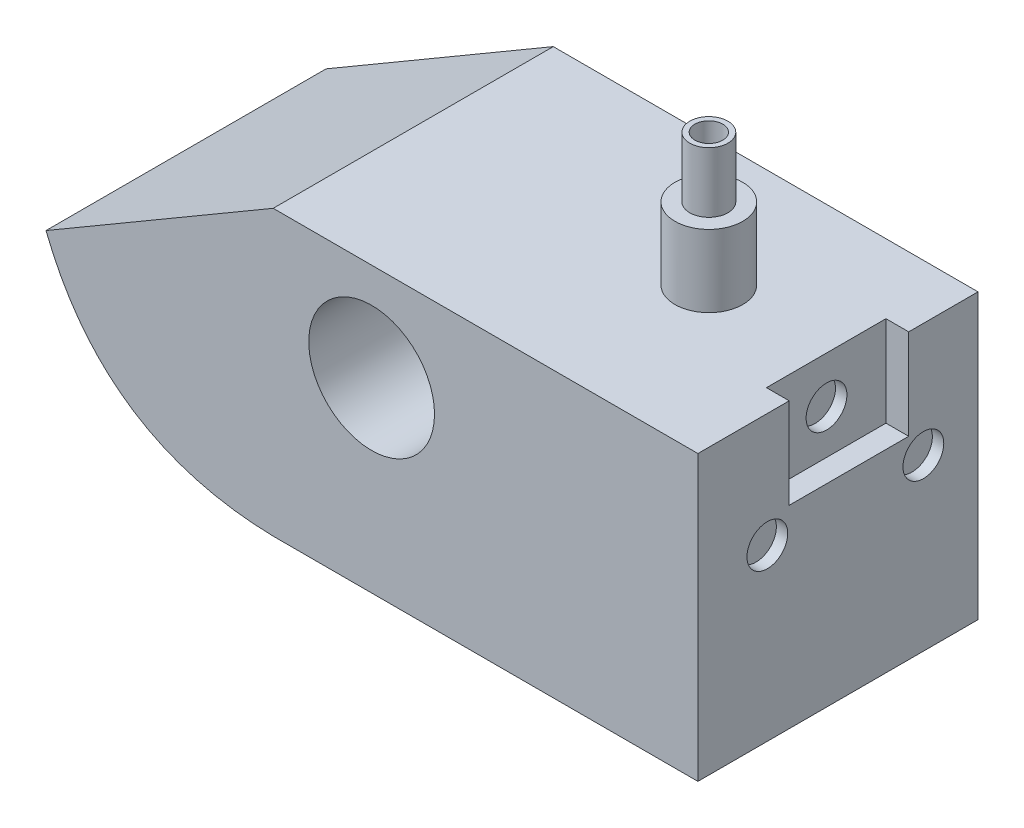
ISO-10303-21;
HEADER;
FILE_DESCRIPTION(('STEP AP214'),'2;1');
FILE_NAME('part.step','',(''),(''),'','','');
FILE_SCHEMA(('AUTOMOTIVE_DESIGN { 1 0 10303 214 1 1 1 1 }'));
ENDSEC;
DATA;
#1=APPLICATION_CONTEXT('core data for automotive mechanical design processes');
#2=APPLICATION_PROTOCOL_DEFINITION('international standard','automotive_design',2000,#1);
#3=PRODUCT_CONTEXT('',#1,'mechanical');
#4=PRODUCT('Part','Part','',(#3));
#5=PRODUCT_RELATED_PRODUCT_CATEGORY('part','',(#4));
#6=PRODUCT_DEFINITION_FORMATION('','',#4);
#7=PRODUCT_DEFINITION_CONTEXT('part definition',#1,'design');
#8=PRODUCT_DEFINITION('design','',#6,#7);
#9=PRODUCT_DEFINITION_SHAPE('','',#8);
#10=(LENGTH_UNIT() NAMED_UNIT(*) SI_UNIT(.MILLI.,.METRE.));
#11=(NAMED_UNIT(*) PLANE_ANGLE_UNIT() SI_UNIT($,.RADIAN.));
#12=(NAMED_UNIT(*) SI_UNIT($,.STERADIAN.) SOLID_ANGLE_UNIT());
#13=UNCERTAINTY_MEASURE_WITH_UNIT(LENGTH_MEASURE(1.E-05),#10,'distance_accuracy_value','');
#14=(GEOMETRIC_REPRESENTATION_CONTEXT(3) GLOBAL_UNCERTAINTY_ASSIGNED_CONTEXT((#13)) GLOBAL_UNIT_ASSIGNED_CONTEXT((#10,
#11,#12)) REPRESENTATION_CONTEXT('',''));
#15=CARTESIAN_POINT('',(0.,0.,0.));
#16=DIRECTION('',(0.,0.,1.));
#17=DIRECTION('',(1.,0.,0.));
#18=AXIS2_PLACEMENT_3D('',#15,#16,#17);
#19=CARTESIAN_POINT('',(-73.4910521687007,48.7691068327466,49.22));
#20=DIRECTION('',(0.,-1.,0.));
#21=DIRECTION('',(0.,0.,-1.));
#22=AXIS2_PLACEMENT_3D('',#19,#20,#21);
#23=PLANE('',#22);
#24=CARTESIAN_POINT('',(-23.5310521687007,48.7691068327466,22.62));
#25=DIRECTION('',(0.,-1.,0.));
#26=DIRECTION('',(0.,0.,-1.));
#27=AXIS2_PLACEMENT_3D('',#24,#25,#26);
#28=CIRCLE('',#27,5.95);
#29=CARTESIAN_POINT('',(-23.5310521687007,48.7691068327466,16.67));
#30=VERTEX_POINT('',#29);
#31=EDGE_CURVE('E49',#30,#30,#28,.F.);
#32=ORIENTED_EDGE('',*,*,#31,.F.);
#33=EDGE_LOOP('',(#32));
#34=FACE_BOUND('',#33,.T.);
#35=DIRECTION('',(-1.,0.,0.));
#36=VECTOR('',#35,1.);
#37=CARTESIAN_POINT('',(181.866193760241,48.7691068327466,12.1762647774396));
#38=LINE('',#37,#36);
#39=CARTESIAN_POINT('',(1.14894783129929,48.7691068327466,12.1762647774396));
#40=VERTEX_POINT('',#39);
#41=CARTESIAN_POINT('',(-2.85105216870071,48.7691068327466,12.1762647774396));
#42=VERTEX_POINT('',#41);
#43=EDGE_CURVE('E62',#40,#42,#38,.T.);
#44=ORIENTED_EDGE('',*,*,#43,.F.);
#45=DIRECTION('',(0.,0.,-1.));
#46=VECTOR('',#45,1.);
#47=CARTESIAN_POINT('',(1.14894783129929,48.7691068327466,49.22));
#48=LINE('',#47,#46);
#49=CARTESIAN_POINT('',(1.14894783129929,48.7691068327466,0.));
#50=VERTEX_POINT('',#49);
#51=EDGE_CURVE('E150',#40,#50,#48,.T.);
#52=ORIENTED_EDGE('',*,*,#51,.T.);
#53=DIRECTION('',(-1.,0.,0.));
#54=VECTOR('',#53,1.);
#55=CARTESIAN_POINT('',(-73.4910521687007,48.7691068327466,0.));
#56=LINE('',#55,#54);
#57=CARTESIAN_POINT('',(-73.4910521687007,48.7691068327466,0.));
#58=VERTEX_POINT('',#57);
#59=EDGE_CURVE('E356',#50,#58,#56,.T.);
#60=ORIENTED_EDGE('',*,*,#59,.T.);
#61=DIRECTION('',(0.,0.,-1.));
#62=VECTOR('',#61,1.);
#63=CARTESIAN_POINT('',(-73.4910521687007,48.7691068327466,49.22));
#64=LINE('',#63,#62);
#65=CARTESIAN_POINT('',(-73.4910521687007,48.7691068327466,49.22));
#66=VERTEX_POINT('',#65);
#67=EDGE_CURVE('E342',#66,#58,#64,.T.);
#68=ORIENTED_EDGE('',*,*,#67,.F.);
#69=DIRECTION('',(-1.,0.,0.));
#70=VECTOR('',#69,1.);
#71=CARTESIAN_POINT('',(-73.4910521687007,48.7691068327466,49.22));
#72=LINE('',#71,#70);
#73=CARTESIAN_POINT('',(1.14894783129929,48.7691068327466,49.22));
#74=VERTEX_POINT('',#73);
#75=EDGE_CURVE('E96',#74,#66,#72,.T.);
#76=ORIENTED_EDGE('',*,*,#75,.F.);
#77=CARTESIAN_POINT('',(1.14894783129929,48.7691068327466,33.1762647774396));
#78=VERTEX_POINT('',#77);
#79=EDGE_CURVE('E338',#74,#78,#48,.T.);
#80=ORIENTED_EDGE('',*,*,#79,.T.);
#81=DIRECTION('',(-1.,0.,0.));
#82=VECTOR('',#81,1.);
#83=CARTESIAN_POINT('',(181.866193760241,48.7691068327466,33.1762647774396));
#84=LINE('',#83,#82);
#85=CARTESIAN_POINT('',(-2.85105216870071,48.7691068327466,33.1762647774396));
#86=VERTEX_POINT('',#85);
#87=EDGE_CURVE('E165',#78,#86,#84,.T.);
#88=ORIENTED_EDGE('',*,*,#87,.T.);
#89=DIRECTION('',(0.,0.,-1.));
#90=VECTOR('',#89,1.);
#91=CARTESIAN_POINT('',(-2.85105216870071,48.7691068327466,49.22));
#92=LINE('',#91,#90);
#93=EDGE_CURVE('E152',#86,#42,#92,.T.);
#94=ORIENTED_EDGE('',*,*,#93,.T.);
#95=EDGE_LOOP('',(#44,#52,#60,#68,#76,#80,#88,#94));
#96=FACE_BOUND('',#95,.T.);
#97=ADVANCED_FACE('F45',(#34,#96),#23,.F.);
#98=CARTESIAN_POINT('',(0.,0.,49.22));
#99=DIRECTION('',(0.,0.,1.));
#100=DIRECTION('',(1.,0.,0.));
#101=AXIS2_PLACEMENT_3D('',#98,#99,#100);
#102=PLANE('',#101);
#103=DIRECTION('',(0.,1.,0.));
#104=VECTOR('',#103,1.);
#105=CARTESIAN_POINT('',(1.14894783129929,48.7691068327466,49.22));
#106=LINE('',#105,#104);
#107=CARTESIAN_POINT('',(1.1489478312993,-1.13089316725344,49.22));
#108=VERTEX_POINT('',#107);
#109=EDGE_CURVE('E355',#108,#74,#106,.T.);
#110=ORIENTED_EDGE('',*,*,#109,.T.);
#111=ORIENTED_EDGE('',*,*,#75,.T.);
#112=DIRECTION('',(-0.863241939107095,-0.504790406571503,0.));
#113=VECTOR('',#112,1.);
#114=CARTESIAN_POINT('',(-73.4910521687007,48.7691068327466,49.22));
#115=LINE('',#114,#113);
#116=CARTESIAN_POINT('',(-113.415991852404,25.4225505288146,49.22));
#117=VERTEX_POINT('',#116);
#118=EDGE_CURVE('E189',#66,#117,#115,.T.);
#119=ORIENTED_EDGE('',*,*,#118,.T.);
#120=CARTESIAN_POINT('',(-113.415991852404,25.4225505288146,49.22));
#121=CARTESIAN_POINT('',(-103.220713409512,-0.463611859677209,49.22));
#122=CARTESIAN_POINT('',(-73.4910521687007,-1.13089316725344,49.22));
#123=B_SPLINE_CURVE_WITH_KNOTS('',2,(#120,#121,#122),.UNSPECIFIED.,.F.,.F.,(3,3),(0.,1.),.UNSPECIFIED.);
#124=CARTESIAN_POINT('',(-73.4910521687007,-1.13089316725344,49.22));
#125=VERTEX_POINT('',#124);
#126=EDGE_CURVE('E192',#117,#125,#123,.T.);
#127=ORIENTED_EDGE('',*,*,#126,.T.);
#128=DIRECTION('',(1.,0.,0.));
#129=VECTOR('',#128,1.);
#130=CARTESIAN_POINT('',(-73.4910521687007,-1.13089316725344,49.22));
#131=LINE('',#130,#129);
#132=EDGE_CURVE('E71',#125,#108,#131,.T.);
#133=ORIENTED_EDGE('',*,*,#132,.T.);
#134=EDGE_LOOP('',(#110,#111,#119,#127,#133));
#135=FACE_BOUND('',#134,.T.);
#136=CARTESIAN_POINT('',(-56.1910521687007,31.6094533185696,49.22));
#137=DIRECTION('',(0.,0.,1.));
#138=DIRECTION('',(1.,0.,0.));
#139=AXIS2_PLACEMENT_3D('',#136,#137,#138);
#140=CIRCLE('',#139,11.05);
#141=CARTESIAN_POINT('',(-45.1410521687007,31.6094533185696,49.22));
#142=VERTEX_POINT('',#141);
#143=EDGE_CURVE('E362',#142,#142,#140,.T.);
#144=ORIENTED_EDGE('',*,*,#143,.F.);
#145=EDGE_LOOP('',(#144));
#146=FACE_BOUND('',#145,.T.);
#147=ADVANCED_FACE('F221',(#135,#146),#102,.T.);
#148=CARTESIAN_POINT('',(0.,0.,0.));
#149=DIRECTION('',(0.,0.,1.));
#150=DIRECTION('',(1.,0.,0.));
#151=AXIS2_PLACEMENT_3D('',#148,#149,#150);
#152=PLANE('',#151);
#153=DIRECTION('',(0.,1.,0.));
#154=VECTOR('',#153,1.);
#155=CARTESIAN_POINT('',(1.14894783129929,48.7691068327466,0.));
#156=LINE('',#155,#154);
#157=CARTESIAN_POINT('',(1.1489478312993,-1.13089316725344,0.));
#158=VERTEX_POINT('',#157);
#159=EDGE_CURVE('E359',#158,#50,#156,.T.);
#160=ORIENTED_EDGE('',*,*,#159,.F.);
#161=DIRECTION('',(1.,0.,0.));
#162=VECTOR('',#161,1.);
#163=CARTESIAN_POINT('',(-73.4910521687007,-1.13089316725344,0.));
#164=LINE('',#163,#162);
#165=CARTESIAN_POINT('',(-73.4910521687007,-1.13089316725344,0.));
#166=VERTEX_POINT('',#165);
#167=EDGE_CURVE('E88',#166,#158,#164,.T.);
#168=ORIENTED_EDGE('',*,*,#167,.F.);
#169=CARTESIAN_POINT('',(-113.415991852404,25.4225505288146,0.));
#170=CARTESIAN_POINT('',(-103.220713409512,-0.463611859677209,0.));
#171=CARTESIAN_POINT('',(-73.4910521687007,-1.13089316725344,0.));
#172=B_SPLINE_CURVE_WITH_KNOTS('',2,(#169,#170,#171),.UNSPECIFIED.,.F.,.F.,(3,3),(0.,1.),.UNSPECIFIED.);
#173=CARTESIAN_POINT('',(-113.415991852404,25.4225505288146,0.));
#174=VERTEX_POINT('',#173);
#175=EDGE_CURVE('E193',#174,#166,#172,.T.);
#176=ORIENTED_EDGE('',*,*,#175,.F.);
#177=DIRECTION('',(-0.863241939107095,-0.504790406571503,0.));
#178=VECTOR('',#177,1.);
#179=CARTESIAN_POINT('',(-73.4910521687007,48.7691068327466,0.));
#180=LINE('',#179,#178);
#181=EDGE_CURVE('E188',#58,#174,#180,.T.);
#182=ORIENTED_EDGE('',*,*,#181,.F.);
#183=ORIENTED_EDGE('',*,*,#59,.F.);
#184=EDGE_LOOP('',(#160,#168,#176,#182,#183));
#185=FACE_BOUND('',#184,.T.);
#186=CARTESIAN_POINT('',(-56.1910521687007,31.6094533185696,0.));
#187=DIRECTION('',(0.,0.,1.));
#188=DIRECTION('',(1.,0.,0.));
#189=AXIS2_PLACEMENT_3D('',#186,#187,#188);
#190=CIRCLE('',#189,11.05);
#191=CARTESIAN_POINT('',(-45.1410521687007,31.6094533185696,0.));
#192=VERTEX_POINT('',#191);
#193=EDGE_CURVE('E369',#192,#192,#190,.T.);
#194=ORIENTED_EDGE('',*,*,#193,.T.);
#195=EDGE_LOOP('',(#194));
#196=FACE_BOUND('',#195,.T.);
#197=ADVANCED_FACE('F224',(#185,#196),#152,.F.);
#198=CARTESIAN_POINT('',(1.14894783129929,48.7691068327466,49.22));
#199=DIRECTION('',(-1.,0.,0.));
#200=DIRECTION('',(0.,-1.,0.));
#201=AXIS2_PLACEMENT_3D('',#198,#199,#200);
#202=PLANE('',#201);
#203=CARTESIAN_POINT('',(1.14894783129929,28.7191068327466,37.02));
#204=DIRECTION('',(1.,0.,0.));
#205=DIRECTION('',(0.,1.,0.));
#206=AXIS2_PLACEMENT_3D('',#203,#204,#205);
#207=CIRCLE('',#206,3.585);
#208=CARTESIAN_POINT('',(1.14894783129929,32.3041068327466,37.02));
#209=VERTEX_POINT('',#208);
#210=EDGE_CURVE('E264',#209,#209,#207,.T.);
#211=ORIENTED_EDGE('',*,*,#210,.F.);
#212=EDGE_LOOP('',(#211));
#213=FACE_BOUND('',#212,.T.);
#214=CARTESIAN_POINT('',(1.14894783129929,28.7191068327466,9.6));
#215=DIRECTION('',(1.,0.,0.));
#216=DIRECTION('',(0.,1.,0.));
#217=AXIS2_PLACEMENT_3D('',#214,#215,#216);
#218=CIRCLE('',#217,3.585);
#219=CARTESIAN_POINT('',(1.14894783129929,32.3041068327466,9.6));
#220=VERTEX_POINT('',#219);
#221=EDGE_CURVE('E256',#220,#220,#218,.T.);
#222=ORIENTED_EDGE('',*,*,#221,.F.);
#223=EDGE_LOOP('',(#222));
#224=FACE_BOUND('',#223,.T.);
#225=ORIENTED_EDGE('',*,*,#51,.F.);
#226=DIRECTION('',(0.,-1.,0.));
#227=VECTOR('',#226,1.);
#228=CARTESIAN_POINT('',(1.14894783129929,32.8691068327466,12.1762647774396));
#229=LINE('',#228,#227);
#230=CARTESIAN_POINT('',(1.14894783129929,32.8691068327466,12.1762647774396));
#231=VERTEX_POINT('',#230);
#232=EDGE_CURVE('E141',#40,#231,#229,.T.);
#233=ORIENTED_EDGE('',*,*,#232,.T.);
#234=DIRECTION('',(0.,0.,1.));
#235=VECTOR('',#234,1.);
#236=CARTESIAN_POINT('',(1.14894783129929,32.8691068327466,33.1762647774396));
#237=LINE('',#236,#235);
#238=CARTESIAN_POINT('',(1.14894783129929,32.8691068327466,33.1762647774396));
#239=VERTEX_POINT('',#238);
#240=EDGE_CURVE('E129',#231,#239,#237,.T.);
#241=ORIENTED_EDGE('',*,*,#240,.T.);
#242=DIRECTION('',(0.,1.,0.));
#243=VECTOR('',#242,1.);
#244=CARTESIAN_POINT('',(1.14894783129929,48.7691068327466,33.1762647774396));
#245=LINE('',#244,#243);
#246=EDGE_CURVE('E140',#239,#78,#245,.T.);
#247=ORIENTED_EDGE('',*,*,#246,.T.);
#248=ORIENTED_EDGE('',*,*,#79,.F.);
#249=ORIENTED_EDGE('',*,*,#109,.F.);
#250=DIRECTION('',(0.,0.,-1.));
#251=VECTOR('',#250,1.);
#252=CARTESIAN_POINT('',(1.1489478312993,-1.13089316725344,49.22));
#253=LINE('',#252,#251);
#254=EDGE_CURVE('E350',#108,#158,#253,.T.);
#255=ORIENTED_EDGE('',*,*,#254,.T.);
#256=ORIENTED_EDGE('',*,*,#159,.T.);
#257=EDGE_LOOP('',(#225,#233,#241,#247,#248,#249,#255,#256));
#258=FACE_BOUND('',#257,.T.);
#259=ADVANCED_FACE('F47',(#213,#224,#258),#202,.F.);
#260=CARTESIAN_POINT('',(-73.4910521687007,-1.13089316725344,49.22));
#261=DIRECTION('',(0.,1.,0.));
#262=DIRECTION('',(0.,0.,1.));
#263=AXIS2_PLACEMENT_3D('',#260,#261,#262);
#264=PLANE('',#263);
#265=ORIENTED_EDGE('',*,*,#167,.T.);
#266=ORIENTED_EDGE('',*,*,#254,.F.);
#267=ORIENTED_EDGE('',*,*,#132,.F.);
#268=DIRECTION('',(0.,0.,-1.));
#269=VECTOR('',#268,1.);
#270=CARTESIAN_POINT('',(-73.4910521687007,-1.13089316725344,49.22));
#271=LINE('',#270,#269);
#272=EDGE_CURVE('E347',#125,#166,#271,.T.);
#273=ORIENTED_EDGE('',*,*,#272,.T.);
#274=EDGE_LOOP('',(#265,#266,#267,#273));
#275=FACE_BOUND('',#274,.T.);
#276=ADVANCED_FACE('F219',(#275),#264,.F.);
#277=CARTESIAN_POINT('',(-56.1910521687007,31.6094533185696,49.22));
#278=DIRECTION('',(0.,0.,-1.));
#279=DIRECTION('',(-1.,0.,0.));
#280=AXIS2_PLACEMENT_3D('',#277,#278,#279);
#281=CYLINDRICAL_SURFACE('',#280,11.05);
#282=ORIENTED_EDGE('',*,*,#143,.T.);
#283=EDGE_LOOP('',(#282));
#284=FACE_BOUND('',#283,.T.);
#285=ORIENTED_EDGE('',*,*,#193,.F.);
#286=EDGE_LOOP('',(#285));
#287=FACE_BOUND('',#286,.T.);
#288=ADVANCED_FACE('F215',(#284,#287),#281,.F.);
#289=CARTESIAN_POINT('',(-73.4910521687007,48.7691068327466,49.22));
#290=DIRECTION('',(0.504790406571503,-0.863241939107095,0.));
#291=DIRECTION('',(0.863241939107095,0.504790406571503,0.));
#292=AXIS2_PLACEMENT_3D('',#289,#290,#291);
#293=PLANE('',#292);
#294=ORIENTED_EDGE('',*,*,#181,.T.);
#295=DIRECTION('',(0.,0.,-1.));
#296=VECTOR('',#295,1.);
#297=CARTESIAN_POINT('',(-113.415991852404,25.4225505288146,49.22));
#298=LINE('',#297,#296);
#299=EDGE_CURVE('E199',#117,#174,#298,.T.);
#300=ORIENTED_EDGE('',*,*,#299,.F.);
#301=ORIENTED_EDGE('',*,*,#118,.F.);
#302=ORIENTED_EDGE('',*,*,#67,.T.);
#303=EDGE_LOOP('',(#294,#300,#301,#302));
#304=FACE_BOUND('',#303,.T.);
#305=ADVANCED_FACE('F210',(#304),#293,.F.);
#306=DIRECTION('',(0.,0.,-1.));
#307=VECTOR('',#306,1.);
#308=SURFACE_OF_LINEAR_EXTRUSION('',#123,#307);
#309=ORIENTED_EDGE('',*,*,#175,.T.);
#310=ORIENTED_EDGE('',*,*,#272,.F.);
#311=ORIENTED_EDGE('',*,*,#126,.F.);
#312=ORIENTED_EDGE('',*,*,#299,.T.);
#313=EDGE_LOOP('',(#309,#310,#311,#312));
#314=FACE_BOUND('',#313,.T.);
#315=ADVANCED_FACE('F205',(#314),#308,.F.);
#316=CARTESIAN_POINT('',(-23.5310521687007,61.4391068327466,22.62));
#317=DIRECTION('',(0.,-1.,0.));
#318=DIRECTION('',(0.,0.,-1.));
#319=AXIS2_PLACEMENT_3D('',#316,#317,#318);
#320=CYLINDRICAL_SURFACE('',#319,5.95);
#321=CARTESIAN_POINT('',(-23.5310521687007,61.4391068327466,22.62));
#322=DIRECTION('',(0.,1.,0.));
#323=DIRECTION('',(0.,0.,1.));
#324=AXIS2_PLACEMENT_3D('',#321,#322,#323);
#325=CIRCLE('',#324,5.95);
#326=CARTESIAN_POINT('',(-23.5310521687007,61.4391068327466,28.57));
#327=VERTEX_POINT('',#326);
#328=EDGE_CURVE('E183',#327,#327,#325,.T.);
#329=ORIENTED_EDGE('',*,*,#328,.F.);
#330=EDGE_LOOP('',(#329));
#331=FACE_BOUND('',#330,.T.);
#332=ORIENTED_EDGE('',*,*,#31,.T.);
#333=EDGE_LOOP('',(#332));
#334=FACE_BOUND('',#333,.T.);
#335=ADVANCED_FACE('F209',(#331,#334),#320,.T.);
#336=CARTESIAN_POINT('',(-23.5310521687007,61.4391068327466,22.62));
#337=DIRECTION('',(0.,1.,0.));
#338=DIRECTION('',(0.,0.,1.));
#339=AXIS2_PLACEMENT_3D('',#336,#337,#338);
#340=PLANE('',#339);
#341=CARTESIAN_POINT('',(-23.5310521687007,61.4391068327466,22.62));
#342=DIRECTION('',(0.,1.,0.));
#343=DIRECTION('',(0.,0.,1.));
#344=AXIS2_PLACEMENT_3D('',#341,#342,#343);
#345=CIRCLE('',#344,3.35);
#346=CARTESIAN_POINT('',(-23.5310521687007,61.4391068327466,25.97));
#347=VERTEX_POINT('',#346);
#348=EDGE_CURVE('E11',#347,#347,#345,.T.);
#349=ORIENTED_EDGE('',*,*,#348,.F.);
#350=EDGE_LOOP('',(#349));
#351=FACE_BOUND('',#350,.T.);
#352=ORIENTED_EDGE('',*,*,#328,.T.);
#353=EDGE_LOOP('',(#352));
#354=FACE_BOUND('',#353,.T.);
#355=ADVANCED_FACE('F325',(#351,#354),#340,.T.);
#356=CARTESIAN_POINT('',(-23.5310521687007,72.0391068327466,22.62));
#357=DIRECTION('',(0.,-1.,0.));
#358=DIRECTION('',(0.,0.,-1.));
#359=AXIS2_PLACEMENT_3D('',#356,#357,#358);
#360=CYLINDRICAL_SURFACE('',#359,3.35);
#361=CARTESIAN_POINT('',(-23.5310521687007,72.0391068327466,22.62));
#362=DIRECTION('',(0.,1.,0.));
#363=DIRECTION('',(0.,0.,1.));
#364=AXIS2_PLACEMENT_3D('',#361,#362,#363);
#365=CIRCLE('',#364,3.35);
#366=CARTESIAN_POINT('',(-23.5310521687007,72.0391068327466,25.97));
#367=VERTEX_POINT('',#366);
#368=EDGE_CURVE('E177',#367,#367,#365,.T.);
#369=ORIENTED_EDGE('',*,*,#368,.F.);
#370=EDGE_LOOP('',(#369));
#371=FACE_BOUND('',#370,.T.);
#372=ORIENTED_EDGE('',*,*,#348,.T.);
#373=EDGE_LOOP('',(#372));
#374=FACE_BOUND('',#373,.T.);
#375=ADVANCED_FACE('F322',(#371,#374),#360,.T.);
#376=CARTESIAN_POINT('',(-23.5310521687007,72.0391068327466,22.62));
#377=DIRECTION('',(0.,1.,0.));
#378=DIRECTION('',(0.,0.,1.));
#379=AXIS2_PLACEMENT_3D('',#376,#377,#378);
#380=PLANE('',#379);
#381=CARTESIAN_POINT('',(-23.5310521687007,72.0391068327466,22.62));
#382=DIRECTION('',(0.,1.,0.));
#383=DIRECTION('',(0.,0.,1.));
#384=AXIS2_PLACEMENT_3D('',#381,#382,#383);
#385=CIRCLE('',#384,2.44715783860278);
#386=CARTESIAN_POINT('',(-23.5310521687007,72.0391068327466,25.0671578386028));
#387=VERTEX_POINT('',#386);
#388=EDGE_CURVE('E146',#387,#387,#385,.T.);
#389=ORIENTED_EDGE('',*,*,#388,.F.);
#390=EDGE_LOOP('',(#389));
#391=FACE_BOUND('',#390,.T.);
#392=ORIENTED_EDGE('',*,*,#368,.T.);
#393=EDGE_LOOP('',(#392));
#394=FACE_BOUND('',#393,.T.);
#395=ADVANCED_FACE('F318',(#391,#394),#380,.T.);
#396=CARTESIAN_POINT('',(-23.5310521687007,68.0391068327466,22.62));
#397=DIRECTION('',(0.,1.,0.));
#398=DIRECTION('',(0.,0.,1.));
#399=AXIS2_PLACEMENT_3D('',#396,#397,#398);
#400=CYLINDRICAL_SURFACE('',#399,2.44715783860278);
#401=CARTESIAN_POINT('',(-23.5310521687007,68.0391068327466,22.62));
#402=DIRECTION('',(0.,1.,0.));
#403=DIRECTION('',(0.,0.,1.));
#404=AXIS2_PLACEMENT_3D('',#401,#402,#403);
#405=CIRCLE('',#404,2.44715783860278);
#406=CARTESIAN_POINT('',(-23.5310521687007,68.0391068327466,25.0671578386028));
#407=VERTEX_POINT('',#406);
#408=EDGE_CURVE('E173',#407,#407,#405,.T.);
#409=ORIENTED_EDGE('',*,*,#408,.F.);
#410=EDGE_LOOP('',(#409));
#411=FACE_BOUND('',#410,.T.);
#412=ORIENTED_EDGE('',*,*,#388,.T.);
#413=EDGE_LOOP('',(#412));
#414=FACE_BOUND('',#413,.T.);
#415=ADVANCED_FACE('F314',(#411,#414),#400,.F.);
#416=CARTESIAN_POINT('',(-23.5310521687007,68.0391068327466,22.62));
#417=DIRECTION('',(0.,1.,0.));
#418=DIRECTION('',(0.,0.,1.));
#419=AXIS2_PLACEMENT_3D('',#416,#417,#418);
#420=PLANE('',#419);
#421=ORIENTED_EDGE('',*,*,#408,.T.);
#422=EDGE_LOOP('',(#421));
#423=FACE_BOUND('',#422,.T.);
#424=ADVANCED_FACE('F309',(#423),#420,.T.);
#425=CARTESIAN_POINT('',(181.866193760241,32.8691068327466,12.1762647774396));
#426=DIRECTION('',(0.,0.,1.));
#427=DIRECTION('',(0.,-1.,0.));
#428=AXIS2_PLACEMENT_3D('',#425,#426,#427);
#429=PLANE('',#428);
#430=ORIENTED_EDGE('',*,*,#232,.F.);
#431=ORIENTED_EDGE('',*,*,#43,.T.);
#432=DIRECTION('',(0.,-1.,0.));
#433=VECTOR('',#432,1.);
#434=CARTESIAN_POINT('',(-2.85105216870071,32.8691068327466,12.1762647774396));
#435=LINE('',#434,#433);
#436=CARTESIAN_POINT('',(-2.85105216870071,32.8691068327465,12.1762647774396));
#437=VERTEX_POINT('',#436);
#438=EDGE_CURVE('E144',#42,#437,#435,.T.);
#439=ORIENTED_EDGE('',*,*,#438,.T.);
#440=DIRECTION('',(-1.,0.,0.));
#441=VECTOR('',#440,1.);
#442=CARTESIAN_POINT('',(181.866193760241,32.8691068327466,12.1762647774396));
#443=LINE('',#442,#441);
#444=EDGE_CURVE('E133',#231,#437,#443,.T.);
#445=ORIENTED_EDGE('',*,*,#444,.F.);
#446=EDGE_LOOP('',(#430,#431,#439,#445));
#447=FACE_BOUND('',#446,.T.);
#448=ADVANCED_FACE('F143',(#447),#429,.T.);
#449=CARTESIAN_POINT('',(181.866193760241,32.8691068327466,33.1762647774396));
#450=DIRECTION('',(0.,1.,0.));
#451=DIRECTION('',(-1.,0.,0.));
#452=AXIS2_PLACEMENT_3D('',#449,#450,#451);
#453=PLANE('',#452);
#454=ORIENTED_EDGE('',*,*,#240,.F.);
#455=ORIENTED_EDGE('',*,*,#444,.T.);
#456=DIRECTION('',(0.,0.,1.));
#457=VECTOR('',#456,1.);
#458=CARTESIAN_POINT('',(-2.85105216870071,32.8691068327466,33.1762647774396));
#459=LINE('',#458,#457);
#460=CARTESIAN_POINT('',(-2.85105216870071,32.8691068327466,33.1762647774396));
#461=VERTEX_POINT('',#460);
#462=EDGE_CURVE('E159',#437,#461,#459,.T.);
#463=ORIENTED_EDGE('',*,*,#462,.T.);
#464=DIRECTION('',(-1.,0.,0.));
#465=VECTOR('',#464,1.);
#466=CARTESIAN_POINT('',(181.866193760241,32.8691068327466,33.1762647774396));
#467=LINE('',#466,#465);
#468=EDGE_CURVE('E135',#239,#461,#467,.T.);
#469=ORIENTED_EDGE('',*,*,#468,.F.);
#470=EDGE_LOOP('',(#454,#455,#463,#469));
#471=FACE_BOUND('',#470,.T.);
#472=ADVANCED_FACE('F131',(#471),#453,.T.);
#473=CARTESIAN_POINT('',(181.866193760241,48.7691068327466,33.1762647774396));
#474=DIRECTION('',(0.,0.,-1.));
#475=DIRECTION('',(-1.,0.,0.));
#476=AXIS2_PLACEMENT_3D('',#473,#474,#475);
#477=PLANE('',#476);
#478=ORIENTED_EDGE('',*,*,#246,.F.);
#479=ORIENTED_EDGE('',*,*,#468,.T.);
#480=DIRECTION('',(0.,1.,0.));
#481=VECTOR('',#480,1.);
#482=CARTESIAN_POINT('',(-2.85105216870071,48.7691068327466,33.1762647774396));
#483=LINE('',#482,#481);
#484=EDGE_CURVE('E164',#461,#86,#483,.T.);
#485=ORIENTED_EDGE('',*,*,#484,.T.);
#486=ORIENTED_EDGE('',*,*,#87,.F.);
#487=EDGE_LOOP('',(#478,#479,#485,#486));
#488=FACE_BOUND('',#487,.T.);
#489=ADVANCED_FACE('F242',(#488),#477,.T.);
#490=CARTESIAN_POINT('',(-2.85105216870071,48.7691068327466,49.22));
#491=DIRECTION('',(-1.,0.,0.));
#492=DIRECTION('',(0.,-1.,0.));
#493=AXIS2_PLACEMENT_3D('',#490,#491,#492);
#494=PLANE('',#493);
#495=CARTESIAN_POINT('',(-2.85105216870071,40.6278422380867,22.6241434274748));
#496=DIRECTION('',(1.,0.,0.));
#497=DIRECTION('',(0.,1.,0.));
#498=AXIS2_PLACEMENT_3D('',#495,#496,#497);
#499=CIRCLE('',#498,3.585);
#500=CARTESIAN_POINT('',(-2.85105216870071,44.2128422380867,22.6241434274748));
#501=VERTEX_POINT('',#500);
#502=EDGE_CURVE('E248',#501,#501,#499,.T.);
#503=ORIENTED_EDGE('',*,*,#502,.F.);
#504=EDGE_LOOP('',(#503));
#505=FACE_BOUND('',#504,.T.);
#506=ORIENTED_EDGE('',*,*,#93,.F.);
#507=ORIENTED_EDGE('',*,*,#484,.F.);
#508=ORIENTED_EDGE('',*,*,#462,.F.);
#509=ORIENTED_EDGE('',*,*,#438,.F.);
#510=EDGE_LOOP('',(#506,#507,#508,#509));
#511=FACE_BOUND('',#510,.T.);
#512=ADVANCED_FACE('F240',(#505,#511),#494,.F.);
#513=CARTESIAN_POINT('',(-4.85105216870071,40.6278422380867,22.6241434274748));
#514=DIRECTION('',(1.,0.,0.));
#515=DIRECTION('',(0.,1.,0.));
#516=AXIS2_PLACEMENT_3D('',#513,#514,#515);
#517=CYLINDRICAL_SURFACE('',#516,3.585);
#518=CARTESIAN_POINT('',(-4.85105216870071,40.6278422380867,22.6241434274748));
#519=DIRECTION('',(1.,0.,0.));
#520=DIRECTION('',(0.,1.,0.));
#521=AXIS2_PLACEMENT_3D('',#518,#519,#520);
#522=CIRCLE('',#521,3.585);
#523=CARTESIAN_POINT('',(-4.85105216870071,44.2128422380867,22.6241434274748));
#524=VERTEX_POINT('',#523);
#525=EDGE_CURVE('E156',#524,#524,#522,.T.);
#526=ORIENTED_EDGE('',*,*,#525,.F.);
#527=EDGE_LOOP('',(#526));
#528=FACE_BOUND('',#527,.T.);
#529=ORIENTED_EDGE('',*,*,#502,.T.);
#530=EDGE_LOOP('',(#529));
#531=FACE_BOUND('',#530,.T.);
#532=ADVANCED_FACE('F296',(#528,#531),#517,.F.);
#533=CARTESIAN_POINT('',(-4.85105216870071,40.6278422380867,22.6241434274748));
#534=DIRECTION('',(1.,0.,0.));
#535=DIRECTION('',(0.,1.,0.));
#536=AXIS2_PLACEMENT_3D('',#533,#534,#535);
#537=PLANE('',#536);
#538=ORIENTED_EDGE('',*,*,#525,.T.);
#539=EDGE_LOOP('',(#538));
#540=FACE_BOUND('',#539,.T.);
#541=ADVANCED_FACE('F287',(#540),#537,.T.);
#542=CARTESIAN_POINT('',(-0.851052168700707,28.7191068327466,9.6));
#543=DIRECTION('',(1.,0.,0.));
#544=DIRECTION('',(0.,1.,0.));
#545=AXIS2_PLACEMENT_3D('',#542,#543,#544);
#546=CYLINDRICAL_SURFACE('',#545,3.585);
#547=CARTESIAN_POINT('',(-0.851052168700707,28.7191068327466,9.6));
#548=DIRECTION('',(1.,0.,0.));
#549=DIRECTION('',(0.,1.,0.));
#550=AXIS2_PLACEMENT_3D('',#547,#548,#549);
#551=CIRCLE('',#550,3.585);
#552=CARTESIAN_POINT('',(-0.851052168700707,32.3041068327466,9.6));
#553=VERTEX_POINT('',#552);
#554=EDGE_CURVE('E252',#553,#553,#551,.T.);
#555=ORIENTED_EDGE('',*,*,#554,.F.);
#556=EDGE_LOOP('',(#555));
#557=FACE_BOUND('',#556,.T.);
#558=ORIENTED_EDGE('',*,*,#221,.T.);
#559=EDGE_LOOP('',(#558));
#560=FACE_BOUND('',#559,.T.);
#561=ADVANCED_FACE('F285',(#557,#560),#546,.F.);
#562=CARTESIAN_POINT('',(-0.851052168700707,28.7191068327466,9.6));
#563=DIRECTION('',(1.,0.,0.));
#564=DIRECTION('',(0.,1.,0.));
#565=AXIS2_PLACEMENT_3D('',#562,#563,#564);
#566=PLANE('',#565);
#567=ORIENTED_EDGE('',*,*,#554,.T.);
#568=EDGE_LOOP('',(#567));
#569=FACE_BOUND('',#568,.T.);
#570=ADVANCED_FACE('F277',(#569),#566,.T.);
#571=CARTESIAN_POINT('',(-0.851052168700707,28.7191068327466,37.02));
#572=DIRECTION('',(1.,0.,0.));
#573=DIRECTION('',(0.,1.,0.));
#574=AXIS2_PLACEMENT_3D('',#571,#572,#573);
#575=CYLINDRICAL_SURFACE('',#574,3.585);
#576=CARTESIAN_POINT('',(-0.851052168700707,28.7191068327466,37.02));
#577=DIRECTION('',(1.,0.,0.));
#578=DIRECTION('',(0.,1.,0.));
#579=AXIS2_PLACEMENT_3D('',#576,#577,#578);
#580=CIRCLE('',#579,3.585);
#581=CARTESIAN_POINT('',(-0.851052168700707,32.3041068327466,37.02));
#582=VERTEX_POINT('',#581);
#583=EDGE_CURVE('E260',#582,#582,#580,.T.);
#584=ORIENTED_EDGE('',*,*,#583,.F.);
#585=EDGE_LOOP('',(#584));
#586=FACE_BOUND('',#585,.T.);
#587=ORIENTED_EDGE('',*,*,#210,.T.);
#588=EDGE_LOOP('',(#587));
#589=FACE_BOUND('',#588,.T.);
#590=ADVANCED_FACE('F274',(#586,#589),#575,.F.);
#591=CARTESIAN_POINT('',(-0.851052168700707,28.7191068327466,37.02));
#592=DIRECTION('',(1.,0.,0.));
#593=DIRECTION('',(0.,1.,0.));
#594=AXIS2_PLACEMENT_3D('',#591,#592,#593);
#595=PLANE('',#594);
#596=ORIENTED_EDGE('',*,*,#583,.T.);
#597=EDGE_LOOP('',(#596));
#598=FACE_BOUND('',#597,.T.);
#599=ADVANCED_FACE('F272',(#598),#595,.T.);
#600=CLOSED_SHELL('',(#97,#147,#197,#259,#276,#288,#305,#315,#335,#355,#375,#395,#415,#424,#448,
#472,#489,#512,#532,#541,#561,#570,#590,#599));
#601=MANIFOLD_SOLID_BREP('B2',#600);
#602=ADVANCED_BREP_SHAPE_REPRESENTATION('',(#18,#601),#14);
#603=SHAPE_DEFINITION_REPRESENTATION(#9,#602);
ENDSEC;
END-ISO-10303-21;
